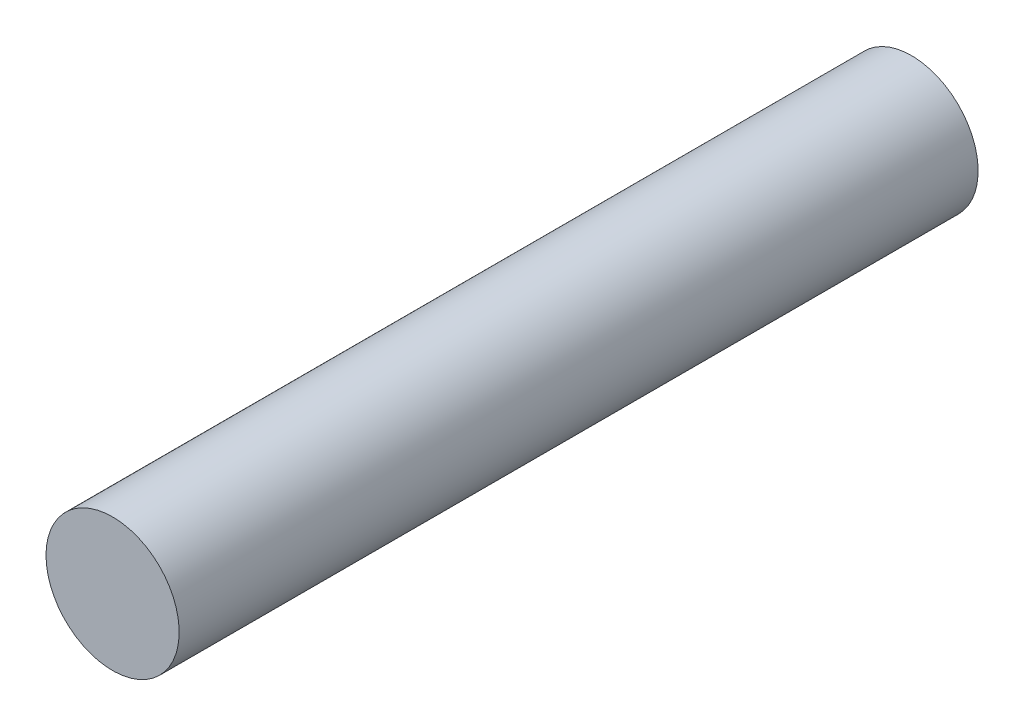
ISO-10303-21;
HEADER;
FILE_DESCRIPTION(('STEP AP214'),'2;1');
FILE_NAME('part.step','',(''),(''),'','','');
FILE_SCHEMA(('AUTOMOTIVE_DESIGN { 1 0 10303 214 1 1 1 1 }'));
ENDSEC;
DATA;
#1=APPLICATION_CONTEXT('core data for automotive mechanical design processes');
#2=APPLICATION_PROTOCOL_DEFINITION('international standard','automotive_design',2000,#1);
#3=PRODUCT_CONTEXT('',#1,'mechanical');
#4=PRODUCT('Part','Part','',(#3));
#5=PRODUCT_RELATED_PRODUCT_CATEGORY('part','',(#4));
#6=PRODUCT_DEFINITION_FORMATION('','',#4);
#7=PRODUCT_DEFINITION_CONTEXT('part definition',#1,'design');
#8=PRODUCT_DEFINITION('design','',#6,#7);
#9=PRODUCT_DEFINITION_SHAPE('','',#8);
#10=(LENGTH_UNIT() NAMED_UNIT(*) SI_UNIT(.MILLI.,.METRE.));
#11=(NAMED_UNIT(*) PLANE_ANGLE_UNIT() SI_UNIT($,.RADIAN.));
#12=(NAMED_UNIT(*) SI_UNIT($,.STERADIAN.) SOLID_ANGLE_UNIT());
#13=UNCERTAINTY_MEASURE_WITH_UNIT(LENGTH_MEASURE(1.E-05),#10,'distance_accuracy_value','');
#14=(GEOMETRIC_REPRESENTATION_CONTEXT(3) GLOBAL_UNCERTAINTY_ASSIGNED_CONTEXT((#13)) GLOBAL_UNIT_ASSIGNED_CONTEXT((#10,
#11,#12)) REPRESENTATION_CONTEXT('',''));
#15=CARTESIAN_POINT('',(0.,0.,0.));
#16=DIRECTION('',(0.,0.,1.));
#17=DIRECTION('',(1.,0.,0.));
#18=AXIS2_PLACEMENT_3D('',#15,#16,#17);
#19=CARTESIAN_POINT('',(0.,0.,76.2));
#20=DIRECTION('',(0.,0.,-1.));
#21=DIRECTION('',(-1.,0.,0.));
#22=AXIS2_PLACEMENT_3D('',#19,#20,#21);
#23=CYLINDRICAL_SURFACE('',#22,6.35);
#24=CARTESIAN_POINT('',(0.,0.,76.2));
#25=DIRECTION('',(0.,0.,1.));
#26=DIRECTION('',(1.,0.,0.));
#27=AXIS2_PLACEMENT_3D('',#24,#25,#26);
#28=CIRCLE('',#27,6.35);
#29=CARTESIAN_POINT('',(-6.35,0.,76.2));
#30=VERTEX_POINT('',#29);
#31=EDGE_CURVE('E10',#30,#30,#28,.T.);
#32=CARTESIAN_POINT('',(0.,0.,0.));
#33=DIRECTION('',(0.,0.,1.));
#34=DIRECTION('',(1.,0.,0.));
#35=AXIS2_PLACEMENT_3D('',#32,#33,#34);
#36=CIRCLE('',#35,6.35);
#37=CARTESIAN_POINT('',(-6.35,0.,0.));
#38=VERTEX_POINT('',#37);
#39=EDGE_CURVE('E46',#38,#38,#36,.T.);
#40=CARTESIAN_POINT('',(-6.35,0.,76.2));
#41=CARTESIAN_POINT('',(-6.35,0.,75.40625));
#42=CARTESIAN_POINT('',(-6.35,0.,74.6125));
#43=CARTESIAN_POINT('',(-6.35,0.,73.025));
#44=CARTESIAN_POINT('',(-6.35,0.,72.23125));
#45=CARTESIAN_POINT('',(-6.35,0.,70.64375));
#46=CARTESIAN_POINT('',(-6.35,0.,69.85));
#47=CARTESIAN_POINT('',(-6.35,0.,68.2625));
#48=CARTESIAN_POINT('',(-6.35,0.,67.46875));
#49=CARTESIAN_POINT('',(-6.35,0.,65.88125));
#50=CARTESIAN_POINT('',(-6.35,0.,65.0875));
#51=CARTESIAN_POINT('',(-6.35,0.,63.5));
#52=CARTESIAN_POINT('',(-6.35,0.,62.70625));
#53=CARTESIAN_POINT('',(-6.35,0.,61.11875));
#54=CARTESIAN_POINT('',(-6.35,0.,60.325));
#55=CARTESIAN_POINT('',(-6.35,0.,58.7375));
#56=CARTESIAN_POINT('',(-6.35,0.,57.94375));
#57=CARTESIAN_POINT('',(-6.35,0.,56.35625));
#58=CARTESIAN_POINT('',(-6.35,0.,55.5625));
#59=CARTESIAN_POINT('',(-6.35,0.,53.975));
#60=CARTESIAN_POINT('',(-6.35,0.,53.18125));
#61=CARTESIAN_POINT('',(-6.35,0.,51.59375));
#62=CARTESIAN_POINT('',(-6.35,0.,50.8));
#63=CARTESIAN_POINT('',(-6.35,0.,49.2125));
#64=CARTESIAN_POINT('',(-6.35,0.,48.41875));
#65=CARTESIAN_POINT('',(-6.35,0.,46.83125));
#66=CARTESIAN_POINT('',(-6.35,0.,46.0375));
#67=CARTESIAN_POINT('',(-6.35,0.,44.45));
#68=CARTESIAN_POINT('',(-6.35,0.,43.65625));
#69=CARTESIAN_POINT('',(-6.35,0.,42.06875));
#70=CARTESIAN_POINT('',(-6.35,0.,41.275));
#71=CARTESIAN_POINT('',(-6.35,0.,39.6875));
#72=CARTESIAN_POINT('',(-6.35,0.,38.89375));
#73=CARTESIAN_POINT('',(-6.35,0.,37.30625));
#74=CARTESIAN_POINT('',(-6.35,0.,36.5125));
#75=CARTESIAN_POINT('',(-6.35,0.,34.925));
#76=CARTESIAN_POINT('',(-6.35,0.,34.13125));
#77=CARTESIAN_POINT('',(-6.35,0.,32.54375));
#78=CARTESIAN_POINT('',(-6.35,0.,31.75));
#79=CARTESIAN_POINT('',(-6.35,0.,30.1625));
#80=CARTESIAN_POINT('',(-6.35,0.,29.36875));
#81=CARTESIAN_POINT('',(-6.35,0.,27.78125));
#82=CARTESIAN_POINT('',(-6.35,0.,26.9875));
#83=CARTESIAN_POINT('',(-6.35,0.,25.4));
#84=CARTESIAN_POINT('',(-6.35,0.,24.60625));
#85=CARTESIAN_POINT('',(-6.35,0.,23.01875));
#86=CARTESIAN_POINT('',(-6.35,0.,22.225));
#87=CARTESIAN_POINT('',(-6.35,0.,20.6375));
#88=CARTESIAN_POINT('',(-6.35,0.,19.84375));
#89=CARTESIAN_POINT('',(-6.35,0.,18.25625));
#90=CARTESIAN_POINT('',(-6.35,0.,17.4625));
#91=CARTESIAN_POINT('',(-6.35,0.,15.875));
#92=CARTESIAN_POINT('',(-6.35,0.,15.08125));
#93=CARTESIAN_POINT('',(-6.35,0.,13.49375));
#94=CARTESIAN_POINT('',(-6.35,0.,12.7));
#95=CARTESIAN_POINT('',(-6.35,0.,11.1125));
#96=CARTESIAN_POINT('',(-6.35,0.,10.31875));
#97=CARTESIAN_POINT('',(-6.35,0.,8.73125));
#98=CARTESIAN_POINT('',(-6.35,0.,7.93750000000001));
#99=CARTESIAN_POINT('',(-6.35,0.,6.35));
#100=CARTESIAN_POINT('',(-6.35,0.,5.55625));
#101=CARTESIAN_POINT('',(-6.35,0.,3.96875));
#102=CARTESIAN_POINT('',(-6.35,0.,3.175));
#103=CARTESIAN_POINT('',(-6.35,0.,1.5875));
#104=CARTESIAN_POINT('',(-6.35,0.,0.793750000000001));
#105=CARTESIAN_POINT('',(-6.35,0.,0.));
#106=B_SPLINE_CURVE_WITH_KNOTS('',3,(#40,#41,#42,#43,#44,#45,#46,#47,#48,#49,#50,#51,#52,#53,
#54,#55,#56,#57,#58,#59,#60,#61,#62,#63,#64,#65,#66,#67,#68,#69,#70,#71,#72,#73,#74,#75,#76,#77,
#78,#79,#80,#81,#82,#83,#84,#85,#86,#87,#88,#89,#90,#91,#92,#93,#94,#95,#96,#97,#98,#99,#100,
#101,#102,#103,#104,#105),.UNSPECIFIED.,.F.,.F.,(4,2,2,2,2,2,2,2,2,2,2,2,2,2,2,2,2,2,2,2,2,2,2,
2,2,2,2,2,2,2,2,2,4),(0.,2.38124999999999,4.76249999999999,7.14374999999999,9.52499999999999,
11.90625,14.2875,16.66875,19.05,21.43125,23.8125,26.19375,28.575,30.95625,33.3375,35.71875,38.1,
40.48125,42.8625,45.24375,47.625,50.00625,52.3875,54.76875,57.15,59.53125,61.9125,64.29375,
66.675,69.05625,71.4375,73.81875,76.2),.UNSPECIFIED.);
#107=EDGE_CURVE('BSEAM43',#30,#38,#106,.T.);
#108=ORIENTED_EDGE('',*,*,#31,.F.);
#109=ORIENTED_EDGE('',*,*,#39,.T.);
#110=ORIENTED_EDGE('',*,*,#107,.T.);
#111=ORIENTED_EDGE('',*,*,#107,.F.);
#112=EDGE_LOOP('',(#108,#110,#109,#111));
#113=FACE_BOUND('',#112,.T.);
#114=ADVANCED_FACE('F43',(#113),#23,.T.);
#115=CARTESIAN_POINT('',(0.,0.,76.2));
#116=DIRECTION('',(0.,0.,1.));
#117=DIRECTION('',(1.,0.,0.));
#118=AXIS2_PLACEMENT_3D('',#115,#116,#117);
#119=PLANE('',#118);
#120=ORIENTED_EDGE('',*,*,#31,.T.);
#121=EDGE_LOOP('',(#120));
#122=FACE_BOUND('',#121,.T.);
#123=ADVANCED_FACE('F62',(#122),#119,.T.);
#124=CARTESIAN_POINT('',(0.,0.,0.));
#125=DIRECTION('',(0.,0.,1.));
#126=DIRECTION('',(1.,0.,0.));
#127=AXIS2_PLACEMENT_3D('',#124,#125,#126);
#128=PLANE('',#127);
#129=ORIENTED_EDGE('',*,*,#39,.F.);
#130=EDGE_LOOP('',(#129));
#131=FACE_BOUND('',#130,.T.);
#132=ADVANCED_FACE('F60',(#131),#128,.F.);
#133=CLOSED_SHELL('',(#114,#123,#132));
#134=MANIFOLD_SOLID_BREP('B2',#133);
#135=ADVANCED_BREP_SHAPE_REPRESENTATION('',(#18,#134),#14);
#136=SHAPE_DEFINITION_REPRESENTATION(#9,#135);
ENDSEC;
END-ISO-10303-21;
